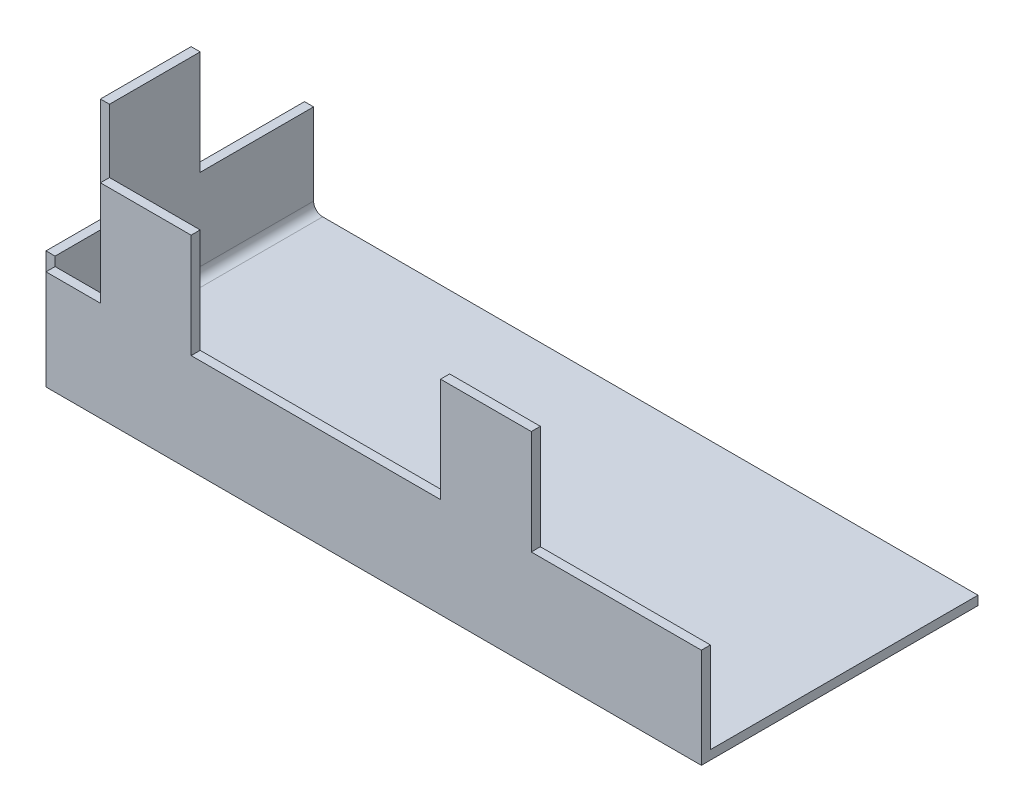
ISO-10303-21;
HEADER;
FILE_DESCRIPTION(('STEP AP214'),'2;1');
FILE_NAME('part.step','',(''),(''),'','','');
FILE_SCHEMA(('AUTOMOTIVE_DESIGN { 1 0 10303 214 1 1 1 1 }'));
ENDSEC;
DATA;
#1=APPLICATION_CONTEXT('core data for automotive mechanical design processes');
#2=APPLICATION_PROTOCOL_DEFINITION('international standard','automotive_design',2000,#1);
#3=PRODUCT_CONTEXT('',#1,'mechanical');
#4=PRODUCT('Part','Part','',(#3));
#5=PRODUCT_RELATED_PRODUCT_CATEGORY('part','',(#4));
#6=PRODUCT_DEFINITION_FORMATION('','',#4);
#7=PRODUCT_DEFINITION_CONTEXT('part definition',#1,'design');
#8=PRODUCT_DEFINITION('design','',#6,#7);
#9=PRODUCT_DEFINITION_SHAPE('','',#8);
#10=(LENGTH_UNIT() NAMED_UNIT(*) SI_UNIT(.MILLI.,.METRE.));
#11=(NAMED_UNIT(*) PLANE_ANGLE_UNIT() SI_UNIT($,.RADIAN.));
#12=(NAMED_UNIT(*) SI_UNIT($,.STERADIAN.) SOLID_ANGLE_UNIT());
#13=UNCERTAINTY_MEASURE_WITH_UNIT(LENGTH_MEASURE(1.E-05),#10,'distance_accuracy_value','');
#14=(GEOMETRIC_REPRESENTATION_CONTEXT(3) GLOBAL_UNCERTAINTY_ASSIGNED_CONTEXT((#13)) GLOBAL_UNIT_ASSIGNED_CONTEXT((#10,
#11,#12)) REPRESENTATION_CONTEXT('',''));
#15=CARTESIAN_POINT('',(0.,0.,0.));
#16=DIRECTION('',(0.,0.,1.));
#17=DIRECTION('',(1.,0.,0.));
#18=AXIS2_PLACEMENT_3D('',#15,#16,#17);
#19=CARTESIAN_POINT('',(14.85,0.,0.));
#20=DIRECTION('',(-1.,0.,0.));
#21=DIRECTION('',(0.,0.,1.));
#22=AXIS2_PLACEMENT_3D('',#19,#20,#21);
#23=PLANE('',#22);
#24=DIRECTION('',(0.,1.,0.));
#25=VECTOR('',#24,1.);
#26=CARTESIAN_POINT('',(14.85,2.,-0.2));
#27=LINE('',#26,#25);
#28=CARTESIAN_POINT('',(14.85,0.,-0.2));
#29=VERTEX_POINT('',#28);
#30=CARTESIAN_POINT('',(14.85,2.,-0.2));
#31=VERTEX_POINT('',#30);
#32=EDGE_CURVE('E260',#29,#31,#27,.T.);
#33=ORIENTED_EDGE('',*,*,#32,.T.);
#34=DIRECTION('',(0.,0.,-1.));
#35=VECTOR('',#34,1.);
#36=CARTESIAN_POINT('',(14.85,2.,0.));
#37=LINE('',#36,#35);
#38=CARTESIAN_POINT('',(14.85,2.,0.));
#39=VERTEX_POINT('',#38);
#40=EDGE_CURVE('E252',#39,#31,#37,.T.);
#41=ORIENTED_EDGE('',*,*,#40,.F.);
#42=DIRECTION('',(0.,1.,0.));
#43=VECTOR('',#42,1.);
#44=CARTESIAN_POINT('',(14.85,2.,0.));
#45=LINE('',#44,#43);
#46=CARTESIAN_POINT('',(14.85,-0.2,0.));
#47=VERTEX_POINT('',#46);
#48=EDGE_CURVE('E265',#47,#39,#45,.T.);
#49=ORIENTED_EDGE('',*,*,#48,.F.);
#50=DIRECTION('',(0.,0.,-1.));
#51=VECTOR('',#50,1.);
#52=CARTESIAN_POINT('',(14.85,-0.2,0.));
#53=LINE('',#52,#51);
#54=CARTESIAN_POINT('',(14.85,-0.2,-6.10000000000355));
#55=VERTEX_POINT('',#54);
#56=EDGE_CURVE('E261',#47,#55,#53,.T.);
#57=ORIENTED_EDGE('',*,*,#56,.T.);
#58=DIRECTION('',(0.,-1.,0.));
#59=VECTOR('',#58,1.);
#60=CARTESIAN_POINT('',(14.85,0.,-6.1));
#61=LINE('',#60,#59);
#62=CARTESIAN_POINT('',(14.85,0.,-6.10000000000355));
#63=VERTEX_POINT('',#62);
#64=EDGE_CURVE('E255',#63,#55,#61,.T.);
#65=ORIENTED_EDGE('',*,*,#64,.F.);
#66=DIRECTION('',(0.,0.,-1.));
#67=VECTOR('',#66,1.);
#68=CARTESIAN_POINT('',(14.85,0.,0.));
#69=LINE('',#68,#67);
#70=EDGE_CURVE('E40',#29,#63,#69,.T.);
#71=ORIENTED_EDGE('',*,*,#70,.F.);
#72=EDGE_LOOP('',(#33,#41,#49,#57,#65,#71));
#73=FACE_BOUND('',#72,.T.);
#74=ADVANCED_FACE('F36',(#73),#23,.F.);
#75=CARTESIAN_POINT('',(0.,0.,-6.1));
#76=DIRECTION('',(0.,0.,-1.));
#77=DIRECTION('',(-1.,0.,0.));
#78=AXIS2_PLACEMENT_3D('',#75,#76,#77);
#79=PLANE('',#78);
#80=CARTESIAN_POINT('',(0.4,0.2,-6.1));
#81=DIRECTION('',(0.,0.,-1.));
#82=DIRECTION('',(-1.,0.,0.));
#83=AXIS2_PLACEMENT_3D('',#80,#81,#82);
#84=CIRCLE('',#83,0.2);
#85=CARTESIAN_POINT('',(0.2,0.2,-6.1));
#86=VERTEX_POINT('',#85);
#87=CARTESIAN_POINT('',(0.4,0.,-6.1));
#88=VERTEX_POINT('',#87);
#89=EDGE_CURVE('E11',#86,#88,#84,.F.);
#90=ORIENTED_EDGE('',*,*,#89,.T.);
#91=DIRECTION('',(1.,0.,0.));
#92=VECTOR('',#91,1.);
#93=CARTESIAN_POINT('',(0.,0.,-6.1));
#94=LINE('',#93,#92);
#95=EDGE_CURVE('E269',#88,#63,#94,.T.);
#96=ORIENTED_EDGE('',*,*,#95,.T.);
#97=ORIENTED_EDGE('',*,*,#64,.T.);
#98=DIRECTION('',(1.,0.,0.));
#99=VECTOR('',#98,1.);
#100=CARTESIAN_POINT('',(0.,-0.2,-6.1));
#101=LINE('',#100,#99);
#102=CARTESIAN_POINT('',(0.4,-0.2,-6.1));
#103=VERTEX_POINT('',#102);
#104=EDGE_CURVE('E262',#103,#55,#101,.T.);
#105=ORIENTED_EDGE('',*,*,#104,.F.);
#106=CARTESIAN_POINT('',(0.4,0.2,-6.1));
#107=DIRECTION('',(0.,0.,-1.));
#108=DIRECTION('',(-1.,0.,0.));
#109=AXIS2_PLACEMENT_3D('',#106,#107,#108);
#110=CIRCLE('',#109,0.4);
#111=CARTESIAN_POINT('',(0.,0.2,-6.1));
#112=VERTEX_POINT('',#111);
#113=EDGE_CURVE('E250',#112,#103,#110,.F.);
#114=ORIENTED_EDGE('',*,*,#113,.F.);
#115=DIRECTION('',(0.,1.,0.));
#116=VECTOR('',#115,1.);
#117=CARTESIAN_POINT('',(0.,2.,-6.1));
#118=LINE('',#117,#116);
#119=CARTESIAN_POINT('',(0.,2.,-6.1));
#120=VERTEX_POINT('',#119);
#121=EDGE_CURVE('E257',#112,#120,#118,.T.);
#122=ORIENTED_EDGE('',*,*,#121,.T.);
#123=DIRECTION('',(1.,0.,0.));
#124=VECTOR('',#123,1.);
#125=CARTESIAN_POINT('',(0.,2.,-6.1));
#126=LINE('',#125,#124);
#127=CARTESIAN_POINT('',(0.2,2.,-6.1));
#128=VERTEX_POINT('',#127);
#129=EDGE_CURVE('E45',#120,#128,#126,.T.);
#130=ORIENTED_EDGE('',*,*,#129,.T.);
#131=DIRECTION('',(0.,1.,0.));
#132=VECTOR('',#131,1.);
#133=CARTESIAN_POINT('',(0.2,2.,-6.1));
#134=LINE('',#133,#132);
#135=EDGE_CURVE('E254',#86,#128,#134,.T.);
#136=ORIENTED_EDGE('',*,*,#135,.F.);
#137=EDGE_LOOP('',(#90,#96,#97,#105,#114,#122,#130,#136));
#138=FACE_BOUND('',#137,.T.);
#139=ADVANCED_FACE('F38',(#138),#79,.T.);
#140=CARTESIAN_POINT('',(0.,2.,0.));
#141=DIRECTION('',(0.,-1.,0.));
#142=DIRECTION('',(0.,0.,-1.));
#143=AXIS2_PLACEMENT_3D('',#140,#141,#142);
#144=PLANE('',#143);
#145=DIRECTION('',(-1.,0.,0.));
#146=VECTOR('',#145,1.);
#147=CARTESIAN_POINT('',(0.,2.,-0.399999999999999));
#148=LINE('',#147,#146);
#149=CARTESIAN_POINT('',(0.2,2.,-0.399999999999999));
#150=VERTEX_POINT('',#149);
#151=CARTESIAN_POINT('',(0.,2.,-0.399999999999999));
#152=VERTEX_POINT('',#151);
#153=EDGE_CURVE('E196',#150,#152,#148,.T.);
#154=ORIENTED_EDGE('',*,*,#153,.F.);
#155=DIRECTION('',(0.,0.,1.));
#156=VECTOR('',#155,1.);
#157=CARTESIAN_POINT('',(0.2,2.,-0.2));
#158=LINE('',#157,#156);
#159=CARTESIAN_POINT('',(0.2,2.,-1.6));
#160=VERTEX_POINT('',#159);
#161=EDGE_CURVE('E309',#160,#150,#158,.T.);
#162=ORIENTED_EDGE('',*,*,#161,.F.);
#163=DIRECTION('',(-1.,0.,0.));
#164=VECTOR('',#163,1.);
#165=CARTESIAN_POINT('',(0.200000000000002,2.,-1.6));
#166=LINE('',#165,#164);
#167=CARTESIAN_POINT('',(0.,2.,-1.6));
#168=VERTEX_POINT('',#167);
#169=EDGE_CURVE('E220',#160,#168,#166,.T.);
#170=ORIENTED_EDGE('',*,*,#169,.T.);
#171=DIRECTION('',(0.,0.,1.));
#172=VECTOR('',#171,1.);
#173=CARTESIAN_POINT('',(0.,2.,0.));
#174=LINE('',#173,#172);
#175=EDGE_CURVE('E213',#168,#152,#174,.T.);
#176=ORIENTED_EDGE('',*,*,#175,.T.);
#177=EDGE_LOOP('',(#154,#162,#170,#176));
#178=FACE_BOUND('',#177,.T.);
#179=ADVANCED_FACE('F219',(#178),#144,.F.);
#180=CARTESIAN_POINT('',(0.200000000000002,4.3,-1.6));
#181=DIRECTION('',(0.,0.,1.));
#182=DIRECTION('',(1.,0.,0.));
#183=AXIS2_PLACEMENT_3D('',#180,#181,#182);
#184=PLANE('',#183);
#185=ORIENTED_EDGE('',*,*,#169,.F.);
#186=DIRECTION('',(0.,-1.,0.));
#187=VECTOR('',#186,1.);
#188=CARTESIAN_POINT('',(0.200000000000002,4.3,-1.6));
#189=LINE('',#188,#187);
#190=CARTESIAN_POINT('',(0.200000000000002,4.3,-1.6));
#191=VERTEX_POINT('',#190);
#192=EDGE_CURVE('E392',#191,#160,#189,.T.);
#193=ORIENTED_EDGE('',*,*,#192,.F.);
#194=DIRECTION('',(-1.,0.,0.));
#195=VECTOR('',#194,1.);
#196=CARTESIAN_POINT('',(0.200000000000002,4.3,-1.6));
#197=LINE('',#196,#195);
#198=CARTESIAN_POINT('',(0.,4.3,-1.6));
#199=VERTEX_POINT('',#198);
#200=EDGE_CURVE('E396',#191,#199,#197,.T.);
#201=ORIENTED_EDGE('',*,*,#200,.T.);
#202=DIRECTION('',(0.,-1.,0.));
#203=VECTOR('',#202,1.);
#204=CARTESIAN_POINT('',(0.,4.3,-1.6));
#205=LINE('',#204,#203);
#206=EDGE_CURVE('E389',#199,#168,#205,.T.);
#207=ORIENTED_EDGE('',*,*,#206,.T.);
#208=EDGE_LOOP('',(#185,#193,#201,#207));
#209=FACE_BOUND('',#208,.T.);
#210=ADVANCED_FACE('F486',(#209),#184,.T.);
#211=CARTESIAN_POINT('',(29.7,4.3,0.));
#212=DIRECTION('',(0.,-1.,0.));
#213=DIRECTION('',(0.,0.,-1.));
#214=AXIS2_PLACEMENT_3D('',#211,#212,#213);
#215=PLANE('',#214);
#216=DIRECTION('',(0.,0.,1.));
#217=VECTOR('',#216,1.);
#218=CARTESIAN_POINT('',(0.200000000000002,4.3,-1.6));
#219=LINE('',#218,#217);
#220=CARTESIAN_POINT('',(0.199999999999999,4.3,-3.6));
#221=VERTEX_POINT('',#220);
#222=EDGE_CURVE('E399',#221,#191,#219,.T.);
#223=ORIENTED_EDGE('',*,*,#222,.F.);
#224=DIRECTION('',(1.,0.,0.));
#225=VECTOR('',#224,1.);
#226=CARTESIAN_POINT('',(0.199999999999999,4.3,-3.6));
#227=LINE('',#226,#225);
#228=CARTESIAN_POINT('',(0.,4.3,-3.6));
#229=VERTEX_POINT('',#228);
#230=EDGE_CURVE('E412',#229,#221,#227,.T.);
#231=ORIENTED_EDGE('',*,*,#230,.F.);
#232=DIRECTION('',(0.,0.,-1.));
#233=VECTOR('',#232,1.);
#234=CARTESIAN_POINT('',(0.,4.3,-1.6));
#235=LINE('',#234,#233);
#236=EDGE_CURVE('E408',#199,#229,#235,.T.);
#237=ORIENTED_EDGE('',*,*,#236,.F.);
#238=ORIENTED_EDGE('',*,*,#200,.F.);
#239=EDGE_LOOP('',(#223,#231,#237,#238));
#240=FACE_BOUND('',#239,.T.);
#241=ADVANCED_FACE('F510',(#240),#215,.F.);
#242=CARTESIAN_POINT('',(37.2,4.3,0.));
#243=DIRECTION('',(0.,-1.,0.));
#244=DIRECTION('',(0.,0.,-1.));
#245=AXIS2_PLACEMENT_3D('',#242,#243,#244);
#246=PLANE('',#245);
#247=DIRECTION('',(0.,0.,-1.));
#248=VECTOR('',#247,1.);
#249=CARTESIAN_POINT('',(9.1,4.3,-0.2));
#250=LINE('',#249,#248);
#251=CARTESIAN_POINT('',(9.1,4.3,0.));
#252=VERTEX_POINT('',#251);
#253=CARTESIAN_POINT('',(9.1,4.3,-0.2));
#254=VERTEX_POINT('',#253);
#255=EDGE_CURVE('E364',#252,#254,#250,.T.);
#256=ORIENTED_EDGE('',*,*,#255,.F.);
#257=DIRECTION('',(-1.,0.,0.));
#258=VECTOR('',#257,1.);
#259=CARTESIAN_POINT('',(9.1,4.3,0.));
#260=LINE('',#259,#258);
#261=CARTESIAN_POINT('',(11.1,4.3,0.));
#262=VERTEX_POINT('',#261);
#263=EDGE_CURVE('E376',#262,#252,#260,.T.);
#264=ORIENTED_EDGE('',*,*,#263,.F.);
#265=DIRECTION('',(0.,0.,1.));
#266=VECTOR('',#265,1.);
#267=CARTESIAN_POINT('',(11.1,4.3,-0.2));
#268=LINE('',#267,#266);
#269=CARTESIAN_POINT('',(11.1,4.3,-0.2));
#270=VERTEX_POINT('',#269);
#271=EDGE_CURVE('E372',#270,#262,#268,.T.);
#272=ORIENTED_EDGE('',*,*,#271,.F.);
#273=DIRECTION('',(1.,0.,0.));
#274=VECTOR('',#273,1.);
#275=CARTESIAN_POINT('',(9.1,4.3,-0.2));
#276=LINE('',#275,#274);
#277=EDGE_CURVE('E360',#254,#270,#276,.T.);
#278=ORIENTED_EDGE('',*,*,#277,.F.);
#279=EDGE_LOOP('',(#256,#264,#272,#278));
#280=FACE_BOUND('',#279,.T.);
#281=ADVANCED_FACE('F504',(#280),#246,.F.);
#282=CARTESIAN_POINT('',(9.1,4.3,-0.2));
#283=DIRECTION('',(-1.,0.,0.));
#284=DIRECTION('',(0.,0.,1.));
#285=AXIS2_PLACEMENT_3D('',#282,#283,#284);
#286=PLANE('',#285);
#287=DIRECTION('',(0.,0.,-1.));
#288=VECTOR('',#287,1.);
#289=CARTESIAN_POINT('',(9.1,2.,-0.2));
#290=LINE('',#289,#288);
#291=CARTESIAN_POINT('',(9.1,2.,0.));
#292=VERTEX_POINT('',#291);
#293=CARTESIAN_POINT('',(9.1,2.,-0.2));
#294=VERTEX_POINT('',#293);
#295=EDGE_CURVE('E365',#292,#294,#290,.T.);
#296=ORIENTED_EDGE('',*,*,#295,.F.);
#297=DIRECTION('',(0.,-1.,0.));
#298=VECTOR('',#297,1.);
#299=CARTESIAN_POINT('',(9.1,4.3,0.));
#300=LINE('',#299,#298);
#301=EDGE_CURVE('E337',#252,#292,#300,.T.);
#302=ORIENTED_EDGE('',*,*,#301,.F.);
#303=ORIENTED_EDGE('',*,*,#255,.T.);
#304=DIRECTION('',(0.,-1.,0.));
#305=VECTOR('',#304,1.);
#306=CARTESIAN_POINT('',(9.1,4.3,-0.2));
#307=LINE('',#306,#305);
#308=EDGE_CURVE('E357',#254,#294,#307,.T.);
#309=ORIENTED_EDGE('',*,*,#308,.T.);
#310=EDGE_LOOP('',(#296,#302,#303,#309));
#311=FACE_BOUND('',#310,.T.);
#312=ADVANCED_FACE('F498',(#311),#286,.T.);
#313=DIRECTION('',(1.,0.,0.));
#314=VECTOR('',#313,1.);
#315=CARTESIAN_POINT('',(0.,2.,0.));
#316=LINE('',#315,#314);
#317=CARTESIAN_POINT('',(3.6,2.,0.));
#318=VERTEX_POINT('',#317);
#319=EDGE_CURVE('E239',#318,#292,#316,.T.);
#320=ORIENTED_EDGE('',*,*,#319,.T.);
#321=ORIENTED_EDGE('',*,*,#295,.T.);
#322=DIRECTION('',(1.,0.,0.));
#323=VECTOR('',#322,1.);
#324=CARTESIAN_POINT('',(0.2,2.,-0.2));
#325=LINE('',#324,#323);
#326=CARTESIAN_POINT('',(3.6,2.,-0.2));
#327=VERTEX_POINT('',#326);
#328=EDGE_CURVE('E230',#327,#294,#325,.T.);
#329=ORIENTED_EDGE('',*,*,#328,.F.);
#330=DIRECTION('',(0.,0.,1.));
#331=VECTOR('',#330,1.);
#332=CARTESIAN_POINT('',(3.6,2.,-0.2));
#333=LINE('',#332,#331);
#334=EDGE_CURVE('E328',#327,#318,#333,.T.);
#335=ORIENTED_EDGE('',*,*,#334,.T.);
#336=EDGE_LOOP('',(#320,#321,#329,#335));
#337=FACE_BOUND('',#336,.T.);
#338=ADVANCED_FACE('F455',(#337),#144,.F.);
#339=CARTESIAN_POINT('',(3.6,4.3,-0.2));
#340=DIRECTION('',(1.,0.,0.));
#341=DIRECTION('',(0.,0.,-1.));
#342=AXIS2_PLACEMENT_3D('',#339,#340,#341);
#343=PLANE('',#342);
#344=ORIENTED_EDGE('',*,*,#334,.F.);
#345=DIRECTION('',(0.,-1.,0.));
#346=VECTOR('',#345,1.);
#347=CARTESIAN_POINT('',(3.6,4.3,-0.2));
#348=LINE('',#347,#346);
#349=CARTESIAN_POINT('',(3.6,4.3,-0.2));
#350=VERTEX_POINT('',#349);
#351=EDGE_CURVE('E319',#350,#327,#348,.T.);
#352=ORIENTED_EDGE('',*,*,#351,.F.);
#353=DIRECTION('',(0.,0.,1.));
#354=VECTOR('',#353,1.);
#355=CARTESIAN_POINT('',(3.6,4.3,-0.2));
#356=LINE('',#355,#354);
#357=CARTESIAN_POINT('',(3.6,4.3,0.));
#358=VERTEX_POINT('',#357);
#359=EDGE_CURVE('E341',#350,#358,#356,.T.);
#360=ORIENTED_EDGE('',*,*,#359,.T.);
#361=DIRECTION('',(0.,-1.,0.));
#362=VECTOR('',#361,1.);
#363=CARTESIAN_POINT('',(3.6,4.3,0.));
#364=LINE('',#363,#362);
#365=EDGE_CURVE('E316',#358,#318,#364,.T.);
#366=ORIENTED_EDGE('',*,*,#365,.T.);
#367=EDGE_LOOP('',(#344,#352,#360,#366));
#368=FACE_BOUND('',#367,.T.);
#369=ADVANCED_FACE('F451',(#368),#343,.T.);
#370=CARTESIAN_POINT('',(29.7,4.3,0.));
#371=DIRECTION('',(0.,-1.,0.));
#372=DIRECTION('',(0.,0.,-1.));
#373=AXIS2_PLACEMENT_3D('',#370,#371,#372);
#374=PLANE('',#373);
#375=DIRECTION('',(0.,0.,-1.));
#376=VECTOR('',#375,1.);
#377=CARTESIAN_POINT('',(1.6,4.3,-0.2));
#378=LINE('',#377,#376);
#379=CARTESIAN_POINT('',(1.6,4.3,0.));
#380=VERTEX_POINT('',#379);
#381=CARTESIAN_POINT('',(1.6,4.3,-0.2));
#382=VERTEX_POINT('',#381);
#383=EDGE_CURVE('E332',#380,#382,#378,.T.);
#384=ORIENTED_EDGE('',*,*,#383,.F.);
#385=DIRECTION('',(-1.,0.,0.));
#386=VECTOR('',#385,1.);
#387=CARTESIAN_POINT('',(1.6,4.3,0.));
#388=LINE('',#387,#386);
#389=EDGE_CURVE('E344',#358,#380,#388,.T.);
#390=ORIENTED_EDGE('',*,*,#389,.F.);
#391=ORIENTED_EDGE('',*,*,#359,.F.);
#392=DIRECTION('',(1.,0.,0.));
#393=VECTOR('',#392,1.);
#394=CARTESIAN_POINT('',(1.6,4.3,-0.2));
#395=LINE('',#394,#393);
#396=EDGE_CURVE('E327',#382,#350,#395,.T.);
#397=ORIENTED_EDGE('',*,*,#396,.F.);
#398=EDGE_LOOP('',(#384,#390,#391,#397));
#399=FACE_BOUND('',#398,.T.);
#400=ADVANCED_FACE('F448',(#399),#374,.F.);
#401=CARTESIAN_POINT('',(1.6,4.3,-0.2));
#402=DIRECTION('',(-1.,0.,0.));
#403=DIRECTION('',(0.,0.,1.));
#404=AXIS2_PLACEMENT_3D('',#401,#402,#403);
#405=PLANE('',#404);
#406=DIRECTION('',(0.,0.,-1.));
#407=VECTOR('',#406,1.);
#408=CARTESIAN_POINT('',(1.6,2.,-0.2));
#409=LINE('',#408,#407);
#410=CARTESIAN_POINT('',(1.6,2.,0.));
#411=VERTEX_POINT('',#410);
#412=CARTESIAN_POINT('',(1.6,2.,-0.2));
#413=VERTEX_POINT('',#412);
#414=EDGE_CURVE('E333',#411,#413,#409,.T.);
#415=ORIENTED_EDGE('',*,*,#414,.F.);
#416=DIRECTION('',(0.,-1.,0.));
#417=VECTOR('',#416,1.);
#418=CARTESIAN_POINT('',(1.6,4.3,0.));
#419=LINE('',#418,#417);
#420=EDGE_CURVE('E312',#380,#411,#419,.T.);
#421=ORIENTED_EDGE('',*,*,#420,.F.);
#422=ORIENTED_EDGE('',*,*,#383,.T.);
#423=DIRECTION('',(0.,-1.,0.));
#424=VECTOR('',#423,1.);
#425=CARTESIAN_POINT('',(1.6,4.3,-0.2));
#426=LINE('',#425,#424);
#427=EDGE_CURVE('E323',#382,#413,#426,.T.);
#428=ORIENTED_EDGE('',*,*,#427,.T.);
#429=EDGE_LOOP('',(#415,#421,#422,#428));
#430=FACE_BOUND('',#429,.T.);
#431=ADVANCED_FACE('F442',(#430),#405,.T.);
#432=DIRECTION('',(0.,0.,-1.));
#433=VECTOR('',#432,1.);
#434=CARTESIAN_POINT('',(0.4,2.,0.));
#435=LINE('',#434,#433);
#436=CARTESIAN_POINT('',(0.4,2.,0.));
#437=VERTEX_POINT('',#436);
#438=CARTESIAN_POINT('',(0.4,2.,-0.2));
#439=VERTEX_POINT('',#438);
#440=EDGE_CURVE('E206',#437,#439,#435,.T.);
#441=ORIENTED_EDGE('',*,*,#440,.F.);
#442=EDGE_CURVE('E236',#437,#411,#316,.T.);
#443=ORIENTED_EDGE('',*,*,#442,.T.);
#444=ORIENTED_EDGE('',*,*,#414,.T.);
#445=EDGE_CURVE('E223',#439,#413,#325,.T.);
#446=ORIENTED_EDGE('',*,*,#445,.F.);
#447=EDGE_LOOP('',(#441,#443,#444,#446));
#448=FACE_BOUND('',#447,.T.);
#449=ADVANCED_FACE('F439',(#448),#144,.F.);
#450=CARTESIAN_POINT('',(0.4,2.,0.));
#451=DIRECTION('',(-1.,0.,0.));
#452=DIRECTION('',(0.,0.,1.));
#453=AXIS2_PLACEMENT_3D('',#450,#451,#452);
#454=PLANE('',#453);
#455=DIRECTION('',(0.,0.,-1.));
#456=VECTOR('',#455,1.);
#457=CARTESIAN_POINT('',(0.4,0.,0.));
#458=LINE('',#457,#456);
#459=CARTESIAN_POINT('',(0.4,0.,-0.2));
#460=VERTEX_POINT('',#459);
#461=CARTESIAN_POINT('',(0.4,0.,-0.399999999999999));
#462=VERTEX_POINT('',#461);
#463=EDGE_CURVE('E422',#460,#462,#458,.T.);
#464=ORIENTED_EDGE('',*,*,#463,.T.);
#465=DIRECTION('',(0.,-1.,0.));
#466=VECTOR('',#465,1.);
#467=CARTESIAN_POINT('',(0.4,2.,-0.399999999999999));
#468=LINE('',#467,#466);
#469=CARTESIAN_POINT('',(0.4,-0.2,-0.399999999999999));
#470=VERTEX_POINT('',#469);
#471=EDGE_CURVE('E216',#462,#470,#468,.T.);
#472=ORIENTED_EDGE('',*,*,#471,.T.);
#473=DIRECTION('',(0.,0.,-1.));
#474=VECTOR('',#473,1.);
#475=CARTESIAN_POINT('',(0.4,-0.2,0.));
#476=LINE('',#475,#474);
#477=CARTESIAN_POINT('',(0.4,-0.2,0.));
#478=VERTEX_POINT('',#477);
#479=EDGE_CURVE('E207',#478,#470,#476,.T.);
#480=ORIENTED_EDGE('',*,*,#479,.F.);
#481=DIRECTION('',(0.,-1.,0.));
#482=VECTOR('',#481,1.);
#483=CARTESIAN_POINT('',(0.4,2.,0.));
#484=LINE('',#483,#482);
#485=EDGE_CURVE('E425',#437,#478,#484,.T.);
#486=ORIENTED_EDGE('',*,*,#485,.F.);
#487=ORIENTED_EDGE('',*,*,#440,.T.);
#488=DIRECTION('',(0.,1.,0.));
#489=VECTOR('',#488,1.);
#490=CARTESIAN_POINT('',(0.4,2.,-0.2));
#491=LINE('',#490,#489);
#492=EDGE_CURVE('E420',#460,#439,#491,.T.);
#493=ORIENTED_EDGE('',*,*,#492,.F.);
#494=EDGE_LOOP('',(#464,#472,#480,#486,#487,#493));
#495=FACE_BOUND('',#494,.T.);
#496=ADVANCED_FACE('F434',(#495),#454,.T.);
#497=CARTESIAN_POINT('',(0.199999999999999,4.3,-3.6));
#498=DIRECTION('',(0.,0.,-1.));
#499=DIRECTION('',(-1.,0.,0.));
#500=AXIS2_PLACEMENT_3D('',#497,#498,#499);
#501=PLANE('',#500);
#502=DIRECTION('',(1.,0.,0.));
#503=VECTOR('',#502,1.);
#504=CARTESIAN_POINT('',(0.199999999999999,2.,-3.6));
#505=LINE('',#504,#503);
#506=CARTESIAN_POINT('',(0.,2.,-3.6));
#507=VERTEX_POINT('',#506);
#508=CARTESIAN_POINT('',(0.199999999999999,2.,-3.6));
#509=VERTEX_POINT('',#508);
#510=EDGE_CURVE('E400',#507,#509,#505,.T.);
#511=ORIENTED_EDGE('',*,*,#510,.F.);
#512=DIRECTION('',(0.,-1.,0.));
#513=VECTOR('',#512,1.);
#514=CARTESIAN_POINT('',(0.,4.3,-3.6));
#515=LINE('',#514,#513);
#516=EDGE_CURVE('E385',#229,#507,#515,.T.);
#517=ORIENTED_EDGE('',*,*,#516,.F.);
#518=ORIENTED_EDGE('',*,*,#230,.T.);
#519=DIRECTION('',(0.,-1.,0.));
#520=VECTOR('',#519,1.);
#521=CARTESIAN_POINT('',(0.199999999999999,4.3,-3.6));
#522=LINE('',#521,#520);
#523=EDGE_CURVE('E369',#221,#509,#522,.T.);
#524=ORIENTED_EDGE('',*,*,#523,.T.);
#525=EDGE_LOOP('',(#511,#517,#518,#524));
#526=FACE_BOUND('',#525,.T.);
#527=ADVANCED_FACE('F576',(#526),#501,.T.);
#528=CARTESIAN_POINT('',(0.,0.,0.));
#529=DIRECTION('',(0.,-1.,0.));
#530=DIRECTION('',(0.,0.,-1.));
#531=AXIS2_PLACEMENT_3D('',#528,#529,#530);
#532=PLANE('',#531);
#533=ORIENTED_EDGE('',*,*,#95,.F.);
#534=DIRECTION('',(0.,0.,1.));
#535=VECTOR('',#534,1.);
#536=CARTESIAN_POINT('',(0.4,0.,0.));
#537=LINE('',#536,#535);
#538=EDGE_CURVE('E61',#88,#462,#537,.T.);
#539=ORIENTED_EDGE('',*,*,#538,.T.);
#540=ORIENTED_EDGE('',*,*,#463,.F.);
#541=DIRECTION('',(1.,0.,0.));
#542=VECTOR('',#541,1.);
#543=CARTESIAN_POINT('',(0.2,0.,-0.2));
#544=LINE('',#543,#542);
#545=EDGE_CURVE('E235',#460,#29,#544,.T.);
#546=ORIENTED_EDGE('',*,*,#545,.T.);
#547=ORIENTED_EDGE('',*,*,#70,.T.);
#548=EDGE_LOOP('',(#533,#539,#540,#546,#547));
#549=FACE_BOUND('',#548,.T.);
#550=ADVANCED_FACE('F287',(#549),#532,.F.);
#551=CARTESIAN_POINT('',(0.,2.,-0.399999999999999));
#552=DIRECTION('',(0.,0.,1.));
#553=DIRECTION('',(1.,0.,0.));
#554=AXIS2_PLACEMENT_3D('',#551,#552,#553);
#555=PLANE('',#554);
#556=DIRECTION('',(0.,-1.,0.));
#557=VECTOR('',#556,1.);
#558=CARTESIAN_POINT('',(0.,2.,-0.399999999999999));
#559=LINE('',#558,#557);
#560=CARTESIAN_POINT('',(0.,0.2,-0.399999999999999));
#561=VERTEX_POINT('',#560);
#562=EDGE_CURVE('E199',#152,#561,#559,.T.);
#563=ORIENTED_EDGE('',*,*,#562,.T.);
#564=CARTESIAN_POINT('',(0.4,0.2,-0.399999999999999));
#565=DIRECTION('',(0.,0.,1.));
#566=DIRECTION('',(1.,0.,0.));
#567=AXIS2_PLACEMENT_3D('',#564,#565,#566);
#568=CIRCLE('',#567,0.4);
#569=EDGE_CURVE('E248',#561,#470,#568,.T.);
#570=ORIENTED_EDGE('',*,*,#569,.T.);
#571=ORIENTED_EDGE('',*,*,#471,.F.);
#572=CARTESIAN_POINT('',(0.4,0.2,-0.399999999999999));
#573=DIRECTION('',(0.,0.,1.));
#574=DIRECTION('',(1.,0.,0.));
#575=AXIS2_PLACEMENT_3D('',#572,#573,#574);
#576=CIRCLE('',#575,0.2);
#577=CARTESIAN_POINT('',(0.2,0.2,-0.399999999999999));
#578=VERTEX_POINT('',#577);
#579=EDGE_CURVE('E242',#462,#578,#576,.F.);
#580=ORIENTED_EDGE('',*,*,#579,.T.);
#581=DIRECTION('',(0.,-1.,0.));
#582=VECTOR('',#581,1.);
#583=CARTESIAN_POINT('',(0.2,2.,-0.399999999999999));
#584=LINE('',#583,#582);
#585=EDGE_CURVE('E201',#150,#578,#584,.T.);
#586=ORIENTED_EDGE('',*,*,#585,.F.);
#587=ORIENTED_EDGE('',*,*,#153,.T.);
#588=EDGE_LOOP('',(#563,#570,#571,#580,#586,#587));
#589=FACE_BOUND('',#588,.T.);
#590=ADVANCED_FACE('F198',(#589),#555,.T.);
#591=CARTESIAN_POINT('',(0.,-0.2,0.));
#592=DIRECTION('',(0.,-1.,0.));
#593=DIRECTION('',(0.,0.,-1.));
#594=AXIS2_PLACEMENT_3D('',#591,#592,#593);
#595=PLANE('',#594);
#596=DIRECTION('',(0.,0.,-1.));
#597=VECTOR('',#596,1.);
#598=CARTESIAN_POINT('',(0.4,-0.2,-11.8));
#599=LINE('',#598,#597);
#600=EDGE_CURVE('E244',#470,#103,#599,.T.);
#601=ORIENTED_EDGE('',*,*,#600,.T.);
#602=ORIENTED_EDGE('',*,*,#104,.T.);
#603=ORIENTED_EDGE('',*,*,#56,.F.);
#604=DIRECTION('',(-1.,0.,0.));
#605=VECTOR('',#604,1.);
#606=CARTESIAN_POINT('',(0.,-0.2,0.));
#607=LINE('',#606,#605);
#608=EDGE_CURVE('E404',#47,#478,#607,.T.);
#609=ORIENTED_EDGE('',*,*,#608,.T.);
#610=ORIENTED_EDGE('',*,*,#479,.T.);
#611=EDGE_LOOP('',(#601,#602,#603,#609,#610));
#612=FACE_BOUND('',#611,.T.);
#613=ADVANCED_FACE('F282',(#612),#595,.T.);
#614=CARTESIAN_POINT('',(0.,2.,0.));
#615=DIRECTION('',(1.,0.,0.));
#616=DIRECTION('',(0.,0.,-1.));
#617=AXIS2_PLACEMENT_3D('',#614,#615,#616);
#618=PLANE('',#617);
#619=ORIENTED_EDGE('',*,*,#121,.F.);
#620=DIRECTION('',(0.,0.,-1.));
#621=VECTOR('',#620,1.);
#622=CARTESIAN_POINT('',(0.,0.2,-0.399999999999999));
#623=LINE('',#622,#621);
#624=EDGE_CURVE('E215',#112,#561,#623,.F.);
#625=ORIENTED_EDGE('',*,*,#624,.T.);
#626=ORIENTED_EDGE('',*,*,#562,.F.);
#627=ORIENTED_EDGE('',*,*,#175,.F.);
#628=ORIENTED_EDGE('',*,*,#206,.F.);
#629=ORIENTED_EDGE('',*,*,#236,.T.);
#630=ORIENTED_EDGE('',*,*,#516,.T.);
#631=EDGE_CURVE('E222',#120,#507,#174,.T.);
#632=ORIENTED_EDGE('',*,*,#631,.F.);
#633=EDGE_LOOP('',(#619,#625,#626,#627,#628,#629,#630,#632));
#634=FACE_BOUND('',#633,.T.);
#635=ADVANCED_FACE('F212',(#634),#618,.F.);
#636=CARTESIAN_POINT('',(0.4,0.2,0.));
#637=DIRECTION('',(0.,0.,1.));
#638=DIRECTION('',(1.,0.,0.));
#639=AXIS2_PLACEMENT_3D('',#636,#637,#638);
#640=CYLINDRICAL_SURFACE('',#639,0.4);
#641=ORIENTED_EDGE('',*,*,#624,.F.);
#642=ORIENTED_EDGE('',*,*,#113,.T.);
#643=ORIENTED_EDGE('',*,*,#600,.F.);
#644=ORIENTED_EDGE('',*,*,#569,.F.);
#645=EDGE_LOOP('',(#641,#642,#643,#644));
#646=FACE_BOUND('',#645,.T.);
#647=ADVANCED_FACE('F467',(#646),#640,.T.);
#648=CARTESIAN_POINT('',(0.2,2.,-0.2));
#649=DIRECTION('',(1.,0.,0.));
#650=DIRECTION('',(0.,0.,-1.));
#651=AXIS2_PLACEMENT_3D('',#648,#649,#650);
#652=PLANE('',#651);
#653=DIRECTION('',(0.,0.,1.));
#654=VECTOR('',#653,1.);
#655=CARTESIAN_POINT('',(0.2,0.2,-0.2));
#656=LINE('',#655,#654);
#657=EDGE_CURVE('E53',#578,#86,#656,.F.);
#658=ORIENTED_EDGE('',*,*,#657,.T.);
#659=ORIENTED_EDGE('',*,*,#135,.T.);
#660=EDGE_CURVE('E303',#128,#509,#158,.T.);
#661=ORIENTED_EDGE('',*,*,#660,.T.);
#662=ORIENTED_EDGE('',*,*,#523,.F.);
#663=ORIENTED_EDGE('',*,*,#222,.T.);
#664=ORIENTED_EDGE('',*,*,#192,.T.);
#665=ORIENTED_EDGE('',*,*,#161,.T.);
#666=ORIENTED_EDGE('',*,*,#585,.T.);
#667=EDGE_LOOP('',(#658,#659,#661,#662,#663,#664,#665,#666));
#668=FACE_BOUND('',#667,.T.);
#669=ADVANCED_FACE('F469',(#668),#652,.T.);
#670=CARTESIAN_POINT('',(0.4,0.2,0.));
#671=DIRECTION('',(0.,0.,1.));
#672=DIRECTION('',(1.,0.,0.));
#673=AXIS2_PLACEMENT_3D('',#670,#671,#672);
#674=CYLINDRICAL_SURFACE('',#673,0.2);
#675=ORIENTED_EDGE('',*,*,#89,.F.);
#676=ORIENTED_EDGE('',*,*,#657,.F.);
#677=ORIENTED_EDGE('',*,*,#579,.F.);
#678=ORIENTED_EDGE('',*,*,#538,.F.);
#679=EDGE_LOOP('',(#675,#676,#677,#678));
#680=FACE_BOUND('',#679,.T.);
#681=ADVANCED_FACE('F475',(#680),#674,.F.);
#682=ORIENTED_EDGE('',*,*,#129,.F.);
#683=ORIENTED_EDGE('',*,*,#631,.T.);
#684=ORIENTED_EDGE('',*,*,#510,.T.);
#685=ORIENTED_EDGE('',*,*,#660,.F.);
#686=EDGE_LOOP('',(#682,#683,#684,#685));
#687=FACE_BOUND('',#686,.T.);
#688=ADVANCED_FACE('F489',(#687),#144,.F.);
#689=CARTESIAN_POINT('',(11.1,4.3,-0.2));
#690=DIRECTION('',(1.,0.,0.));
#691=DIRECTION('',(0.,0.,-1.));
#692=AXIS2_PLACEMENT_3D('',#689,#690,#691);
#693=PLANE('',#692);
#694=DIRECTION('',(0.,0.,1.));
#695=VECTOR('',#694,1.);
#696=CARTESIAN_POINT('',(11.1,2.,-0.2));
#697=LINE('',#696,#695);
#698=CARTESIAN_POINT('',(11.1,2.,-0.2));
#699=VERTEX_POINT('',#698);
#700=CARTESIAN_POINT('',(11.1,2.,0.));
#701=VERTEX_POINT('',#700);
#702=EDGE_CURVE('E361',#699,#701,#697,.T.);
#703=ORIENTED_EDGE('',*,*,#702,.F.);
#704=DIRECTION('',(0.,-1.,0.));
#705=VECTOR('',#704,1.);
#706=CARTESIAN_POINT('',(11.1,4.3,-0.2));
#707=LINE('',#706,#705);
#708=EDGE_CURVE('E299',#270,#699,#707,.T.);
#709=ORIENTED_EDGE('',*,*,#708,.F.);
#710=ORIENTED_EDGE('',*,*,#271,.T.);
#711=DIRECTION('',(0.,-1.,0.));
#712=VECTOR('',#711,1.);
#713=CARTESIAN_POINT('',(11.1,4.3,0.));
#714=LINE('',#713,#712);
#715=EDGE_CURVE('E353',#262,#701,#714,.T.);
#716=ORIENTED_EDGE('',*,*,#715,.T.);
#717=EDGE_LOOP('',(#703,#709,#710,#716));
#718=FACE_BOUND('',#717,.T.);
#719=ADVANCED_FACE('F495',(#718),#693,.T.);
#720=CARTESIAN_POINT('',(0.2,2.,-0.2));
#721=DIRECTION('',(0.,0.,-1.));
#722=DIRECTION('',(-1.,0.,0.));
#723=AXIS2_PLACEMENT_3D('',#720,#721,#722);
#724=PLANE('',#723);
#725=ORIENTED_EDGE('',*,*,#32,.F.);
#726=ORIENTED_EDGE('',*,*,#545,.F.);
#727=ORIENTED_EDGE('',*,*,#492,.T.);
#728=ORIENTED_EDGE('',*,*,#445,.T.);
#729=ORIENTED_EDGE('',*,*,#427,.F.);
#730=ORIENTED_EDGE('',*,*,#396,.T.);
#731=ORIENTED_EDGE('',*,*,#351,.T.);
#732=ORIENTED_EDGE('',*,*,#328,.T.);
#733=ORIENTED_EDGE('',*,*,#308,.F.);
#734=ORIENTED_EDGE('',*,*,#277,.T.);
#735=ORIENTED_EDGE('',*,*,#708,.T.);
#736=EDGE_CURVE('E232',#699,#31,#325,.T.);
#737=ORIENTED_EDGE('',*,*,#736,.T.);
#738=EDGE_LOOP('',(#725,#726,#727,#728,#729,#730,#731,#732,#733,#734,#735,#737));
#739=FACE_BOUND('',#738,.T.);
#740=ADVANCED_FACE('F294',(#739),#724,.T.);
#741=CARTESIAN_POINT('',(0.,2.,0.));
#742=DIRECTION('',(0.,0.,-1.));
#743=DIRECTION('',(-1.,0.,0.));
#744=AXIS2_PLACEMENT_3D('',#741,#742,#743);
#745=PLANE('',#744);
#746=ORIENTED_EDGE('',*,*,#608,.F.);
#747=ORIENTED_EDGE('',*,*,#48,.T.);
#748=EDGE_CURVE('E228',#701,#39,#316,.T.);
#749=ORIENTED_EDGE('',*,*,#748,.F.);
#750=ORIENTED_EDGE('',*,*,#715,.F.);
#751=ORIENTED_EDGE('',*,*,#263,.T.);
#752=ORIENTED_EDGE('',*,*,#301,.T.);
#753=ORIENTED_EDGE('',*,*,#319,.F.);
#754=ORIENTED_EDGE('',*,*,#365,.F.);
#755=ORIENTED_EDGE('',*,*,#389,.T.);
#756=ORIENTED_EDGE('',*,*,#420,.T.);
#757=ORIENTED_EDGE('',*,*,#442,.F.);
#758=ORIENTED_EDGE('',*,*,#485,.T.);
#759=EDGE_LOOP('',(#746,#747,#749,#750,#751,#752,#753,#754,#755,#756,#757,#758));
#760=FACE_BOUND('',#759,.T.);
#761=ADVANCED_FACE('F457',(#760),#745,.F.);
#762=ORIENTED_EDGE('',*,*,#748,.T.);
#763=ORIENTED_EDGE('',*,*,#40,.T.);
#764=ORIENTED_EDGE('',*,*,#736,.F.);
#765=ORIENTED_EDGE('',*,*,#702,.T.);
#766=EDGE_LOOP('',(#762,#763,#764,#765));
#767=FACE_BOUND('',#766,.T.);
#768=ADVANCED_FACE('F463',(#767),#144,.F.);
#769=CLOSED_SHELL('',(#74,#139,#179,#210,#241,#281,#312,#338,#369,#400,#431,#449,#496,#527,#550,
#590,#613,#635,#647,#669,#681,#688,#719,#740,#761,#768));
#770=MANIFOLD_SOLID_BREP('B2',#769);
#771=ADVANCED_BREP_SHAPE_REPRESENTATION('',(#18,#770),#14);
#772=SHAPE_DEFINITION_REPRESENTATION(#9,#771);
ENDSEC;
END-ISO-10303-21;
